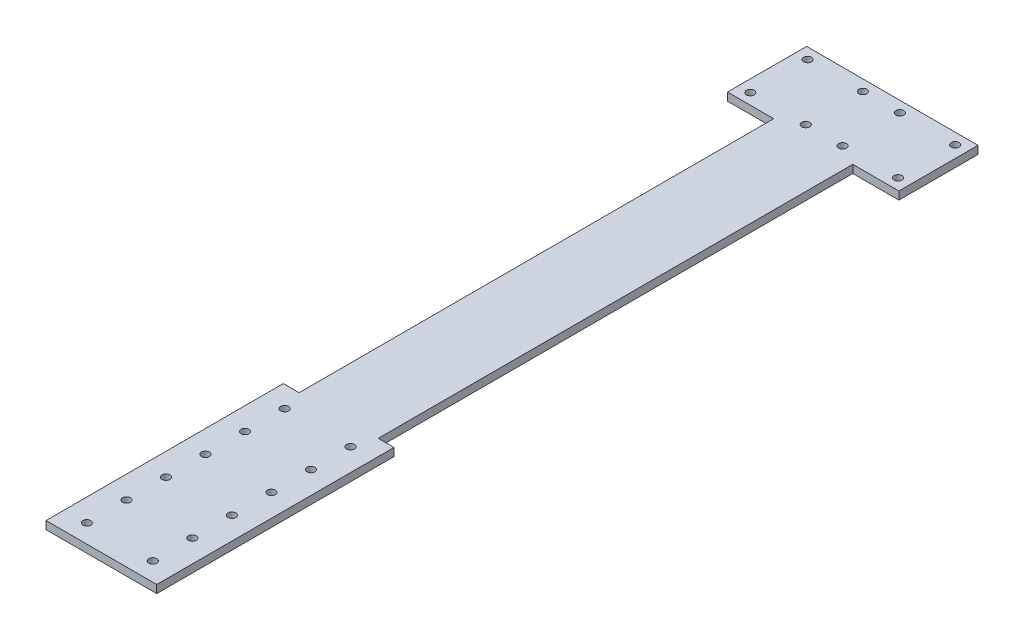
ISO-10303-21;
HEADER;
FILE_DESCRIPTION(('STEP AP214'),'2;1');
FILE_NAME('part.step','',(''),(''),'','','');
FILE_SCHEMA(('AUTOMOTIVE_DESIGN { 1 0 10303 214 1 1 1 1 }'));
ENDSEC;
DATA;
#1=APPLICATION_CONTEXT('core data for automotive mechanical design processes');
#2=APPLICATION_PROTOCOL_DEFINITION('international standard','automotive_design',2000,#1);
#3=PRODUCT_CONTEXT('',#1,'mechanical');
#4=PRODUCT('Part','Part','',(#3));
#5=PRODUCT_RELATED_PRODUCT_CATEGORY('part','',(#4));
#6=PRODUCT_DEFINITION_FORMATION('','',#4);
#7=PRODUCT_DEFINITION_CONTEXT('part definition',#1,'design');
#8=PRODUCT_DEFINITION('design','',#6,#7);
#9=PRODUCT_DEFINITION_SHAPE('','',#8);
#10=(LENGTH_UNIT() NAMED_UNIT(*) SI_UNIT(.MILLI.,.METRE.));
#11=(NAMED_UNIT(*) PLANE_ANGLE_UNIT() SI_UNIT($,.RADIAN.));
#12=(NAMED_UNIT(*) SI_UNIT($,.STERADIAN.) SOLID_ANGLE_UNIT());
#13=UNCERTAINTY_MEASURE_WITH_UNIT(LENGTH_MEASURE(1.E-05),#10,'distance_accuracy_value','');
#14=(GEOMETRIC_REPRESENTATION_CONTEXT(3) GLOBAL_UNCERTAINTY_ASSIGNED_CONTEXT((#13)) GLOBAL_UNIT_ASSIGNED_CONTEXT((#10,
#11,#12)) REPRESENTATION_CONTEXT('',''));
#15=CARTESIAN_POINT('',(0.,0.,0.));
#16=DIRECTION('',(0.,0.,1.));
#17=DIRECTION('',(1.,0.,0.));
#18=AXIS2_PLACEMENT_3D('',#15,#16,#17);
#19=CARTESIAN_POINT('',(0.,3.,0.));
#20=DIRECTION('',(0.,1.,0.));
#21=DIRECTION('',(0.,0.,1.));
#22=AXIS2_PLACEMENT_3D('',#19,#20,#21);
#23=PLANE('',#22);
#24=CARTESIAN_POINT('',(12.5,3.,-22.));
#25=DIRECTION('',(0.,1.,0.));
#26=DIRECTION('',(0.,0.,1.));
#27=AXIS2_PLACEMENT_3D('',#24,#25,#26);
#28=CIRCLE('',#27,1.5);
#29=CARTESIAN_POINT('',(12.5,3.,-20.5));
#30=VERTEX_POINT('',#29);
#31=EDGE_CURVE('E458',#30,#30,#28,.F.);
#32=ORIENTED_EDGE('',*,*,#31,.T.);
#33=EDGE_LOOP('',(#32));
#34=FACE_BOUND('',#33,.T.);
#35=CARTESIAN_POINT('',(-12.5,3.,-6.99999999999999));
#36=DIRECTION('',(0.,1.,0.));
#37=DIRECTION('',(0.,0.,1.));
#38=AXIS2_PLACEMENT_3D('',#35,#36,#37);
#39=CIRCLE('',#38,1.5);
#40=CARTESIAN_POINT('',(-12.5,3.,-5.49999999999999));
#41=VERTEX_POINT('',#40);
#42=EDGE_CURVE('E454',#41,#41,#39,.T.);
#43=ORIENTED_EDGE('',*,*,#42,.F.);
#44=EDGE_LOOP('',(#43));
#45=FACE_BOUND('',#44,.T.);
#46=CARTESIAN_POINT('',(12.5,3.,-52.));
#47=DIRECTION('',(0.,1.,0.));
#48=DIRECTION('',(0.,0.,1.));
#49=AXIS2_PLACEMENT_3D('',#46,#47,#48);
#50=CIRCLE('',#49,1.5);
#51=CARTESIAN_POINT('',(12.5,3.,-50.5));
#52=VERTEX_POINT('',#51);
#53=EDGE_CURVE('E442',#52,#52,#50,.F.);
#54=ORIENTED_EDGE('',*,*,#53,.T.);
#55=EDGE_LOOP('',(#54));
#56=FACE_BOUND('',#55,.T.);
#57=CARTESIAN_POINT('',(-12.5,3.,-37.));
#58=DIRECTION('',(0.,1.,0.));
#59=DIRECTION('',(0.,0.,1.));
#60=AXIS2_PLACEMENT_3D('',#57,#58,#59);
#61=CIRCLE('',#60,1.5);
#62=CARTESIAN_POINT('',(-12.5,3.,-35.5));
#63=VERTEX_POINT('',#62);
#64=EDGE_CURVE('E438',#63,#63,#61,.T.);
#65=ORIENTED_EDGE('',*,*,#64,.F.);
#66=EDGE_LOOP('',(#65));
#67=FACE_BOUND('',#66,.T.);
#68=CARTESIAN_POINT('',(-12.5,3.,-82.));
#69=DIRECTION('',(0.,1.,0.));
#70=DIRECTION('',(0.,0.,1.));
#71=AXIS2_PLACEMENT_3D('',#68,#69,#70);
#72=CIRCLE('',#71,1.5);
#73=CARTESIAN_POINT('',(-12.5,3.,-80.5));
#74=VERTEX_POINT('',#73);
#75=EDGE_CURVE('E481',#74,#74,#72,.T.);
#76=ORIENTED_EDGE('',*,*,#75,.F.);
#77=EDGE_LOOP('',(#76));
#78=FACE_BOUND('',#77,.T.);
#79=DIRECTION('',(0.,0.,1.));
#80=VECTOR('',#79,1.);
#81=CARTESIAN_POINT('',(-32.4999999999998,3.,-300.));
#82=LINE('',#81,#80);
#83=CARTESIAN_POINT('',(-32.4999999999998,3.,-300.));
#84=VERTEX_POINT('',#83);
#85=CARTESIAN_POINT('',(-32.4999999999998,3.,-270.));
#86=VERTEX_POINT('',#85);
#87=EDGE_CURVE('E202',#84,#86,#82,.T.);
#88=ORIENTED_EDGE('',*,*,#87,.T.);
#89=DIRECTION('',(1.,0.,0.));
#90=VECTOR('',#89,1.);
#91=CARTESIAN_POINT('',(-32.4999999999998,3.,-270.));
#92=LINE('',#91,#90);
#93=CARTESIAN_POINT('',(-15.,3.,-270.));
#94=VERTEX_POINT('',#93);
#95=EDGE_CURVE('E114',#86,#94,#92,.T.);
#96=ORIENTED_EDGE('',*,*,#95,.T.);
#97=DIRECTION('',(0.,0.,1.));
#98=VECTOR('',#97,1.);
#99=CARTESIAN_POINT('',(-15.,3.,-270.));
#100=LINE('',#99,#98);
#101=CARTESIAN_POINT('',(-15.,3.,-90.));
#102=VERTEX_POINT('',#101);
#103=EDGE_CURVE('E239',#94,#102,#100,.T.);
#104=ORIENTED_EDGE('',*,*,#103,.T.);
#105=DIRECTION('',(-1.,0.,0.));
#106=VECTOR('',#105,1.);
#107=CARTESIAN_POINT('',(-15.,3.,-90.));
#108=LINE('',#107,#106);
#109=CARTESIAN_POINT('',(-21.,3.,-90.));
#110=VERTEX_POINT('',#109);
#111=EDGE_CURVE('E259',#102,#110,#108,.T.);
#112=ORIENTED_EDGE('',*,*,#111,.T.);
#113=DIRECTION('',(0.,0.,1.));
#114=VECTOR('',#113,1.);
#115=CARTESIAN_POINT('',(-21.,3.,-90.));
#116=LINE('',#115,#114);
#117=CARTESIAN_POINT('',(-21.,3.,0.));
#118=VERTEX_POINT('',#117);
#119=EDGE_CURVE('E255',#110,#118,#116,.T.);
#120=ORIENTED_EDGE('',*,*,#119,.T.);
#121=DIRECTION('',(1.,0.,0.));
#122=VECTOR('',#121,1.);
#123=CARTESIAN_POINT('',(-21.,3.,0.));
#124=LINE('',#123,#122);
#125=CARTESIAN_POINT('',(21.,3.,0.));
#126=VERTEX_POINT('',#125);
#127=EDGE_CURVE('E258',#118,#126,#124,.T.);
#128=ORIENTED_EDGE('',*,*,#127,.T.);
#129=DIRECTION('',(0.,0.,-1.));
#130=VECTOR('',#129,1.);
#131=CARTESIAN_POINT('',(21.,3.,-90.));
#132=LINE('',#131,#130);
#133=CARTESIAN_POINT('',(21.,3.,-90.));
#134=VERTEX_POINT('',#133);
#135=EDGE_CURVE('E263',#126,#134,#132,.T.);
#136=ORIENTED_EDGE('',*,*,#135,.T.);
#137=DIRECTION('',(-1.,0.,0.));
#138=VECTOR('',#137,1.);
#139=CARTESIAN_POINT('',(15.,3.,-90.));
#140=LINE('',#139,#138);
#141=CARTESIAN_POINT('',(15.,3.,-90.));
#142=VERTEX_POINT('',#141);
#143=EDGE_CURVE('E270',#134,#142,#140,.T.);
#144=ORIENTED_EDGE('',*,*,#143,.T.);
#145=DIRECTION('',(0.,0.,-1.));
#146=VECTOR('',#145,1.);
#147=CARTESIAN_POINT('',(15.,3.,-270.));
#148=LINE('',#147,#146);
#149=CARTESIAN_POINT('',(15.,3.,-270.));
#150=VERTEX_POINT('',#149);
#151=EDGE_CURVE('E145',#142,#150,#148,.T.);
#152=ORIENTED_EDGE('',*,*,#151,.T.);
#153=DIRECTION('',(1.,0.,0.));
#154=VECTOR('',#153,1.);
#155=CARTESIAN_POINT('',(32.4999999999998,3.,-270.));
#156=LINE('',#155,#154);
#157=CARTESIAN_POINT('',(32.4999999999998,3.,-270.));
#158=VERTEX_POINT('',#157);
#159=EDGE_CURVE('E139',#150,#158,#156,.T.);
#160=ORIENTED_EDGE('',*,*,#159,.T.);
#161=DIRECTION('',(0.,0.,-1.));
#162=VECTOR('',#161,1.);
#163=CARTESIAN_POINT('',(32.5000000000002,3.,-300.));
#164=LINE('',#163,#162);
#165=CARTESIAN_POINT('',(32.5000000000002,3.,-300.));
#166=VERTEX_POINT('',#165);
#167=EDGE_CURVE('E143',#158,#166,#164,.T.);
#168=ORIENTED_EDGE('',*,*,#167,.T.);
#169=DIRECTION('',(-1.,0.,0.));
#170=VECTOR('',#169,1.);
#171=CARTESIAN_POINT('',(32.5000000000002,3.,-300.));
#172=LINE('',#171,#170);
#173=EDGE_CURVE('E59',#166,#84,#172,.T.);
#174=ORIENTED_EDGE('',*,*,#173,.T.);
#175=EDGE_LOOP('',(#88,#96,#104,#112,#120,#128,#136,#144,#152,#160,#168,#174));
#176=FACE_BOUND('',#175,.T.);
#177=CARTESIAN_POINT('',(-28.,3.,-295.85));
#178=DIRECTION('',(0.,1.,0.));
#179=DIRECTION('',(0.,0.,1.));
#180=AXIS2_PLACEMENT_3D('',#177,#178,#179);
#181=CIRCLE('',#180,1.5);
#182=CARTESIAN_POINT('',(-28.,3.,-294.35));
#183=VERTEX_POINT('',#182);
#184=EDGE_CURVE('E533',#183,#183,#181,.T.);
#185=ORIENTED_EDGE('',*,*,#184,.F.);
#186=EDGE_LOOP('',(#185));
#187=FACE_BOUND('',#186,.T.);
#188=CARTESIAN_POINT('',(-7.00000000000004,3.,-274.15));
#189=DIRECTION('',(0.,1.,0.));
#190=DIRECTION('',(0.,0.,1.));
#191=AXIS2_PLACEMENT_3D('',#188,#189,#190);
#192=CIRCLE('',#191,1.5);
#193=CARTESIAN_POINT('',(-7.00000000000004,3.,-272.65));
#194=VERTEX_POINT('',#193);
#195=EDGE_CURVE('E537',#194,#194,#192,.T.);
#196=ORIENTED_EDGE('',*,*,#195,.F.);
#197=EDGE_LOOP('',(#196));
#198=FACE_BOUND('',#197,.T.);
#199=CARTESIAN_POINT('',(-28.,3.,-274.15));
#200=DIRECTION('',(0.,1.,0.));
#201=DIRECTION('',(0.,0.,1.));
#202=AXIS2_PLACEMENT_3D('',#199,#200,#201);
#203=CIRCLE('',#202,1.5);
#204=CARTESIAN_POINT('',(-28.,3.,-272.65));
#205=VERTEX_POINT('',#204);
#206=EDGE_CURVE('E541',#205,#205,#203,.T.);
#207=ORIENTED_EDGE('',*,*,#206,.F.);
#208=EDGE_LOOP('',(#207));
#209=FACE_BOUND('',#208,.T.);
#210=CARTESIAN_POINT('',(-7.00000000000004,3.,-295.85));
#211=DIRECTION('',(0.,1.,0.));
#212=DIRECTION('',(0.,0.,1.));
#213=AXIS2_PLACEMENT_3D('',#210,#211,#212);
#214=CIRCLE('',#213,1.5);
#215=CARTESIAN_POINT('',(-7.00000000000004,3.,-294.35));
#216=VERTEX_POINT('',#215);
#217=EDGE_CURVE('E172',#216,#216,#214,.T.);
#218=ORIENTED_EDGE('',*,*,#217,.F.);
#219=EDGE_LOOP('',(#218));
#220=FACE_BOUND('',#219,.T.);
#221=CARTESIAN_POINT('',(28.,3.,-295.85));
#222=DIRECTION('',(0.,1.,0.));
#223=DIRECTION('',(0.,0.,1.));
#224=AXIS2_PLACEMENT_3D('',#221,#222,#223);
#225=CIRCLE('',#224,1.5);
#226=CARTESIAN_POINT('',(28.,3.,-294.35));
#227=VERTEX_POINT('',#226);
#228=EDGE_CURVE('E501',#227,#227,#225,.F.);
#229=ORIENTED_EDGE('',*,*,#228,.T.);
#230=EDGE_LOOP('',(#229));
#231=FACE_BOUND('',#230,.T.);
#232=CARTESIAN_POINT('',(7.00000000000004,3.,-274.15));
#233=DIRECTION('',(0.,1.,0.));
#234=DIRECTION('',(0.,0.,1.));
#235=AXIS2_PLACEMENT_3D('',#232,#233,#234);
#236=CIRCLE('',#235,1.5);
#237=CARTESIAN_POINT('',(7.00000000000004,3.,-272.65));
#238=VERTEX_POINT('',#237);
#239=EDGE_CURVE('E505',#238,#238,#236,.F.);
#240=ORIENTED_EDGE('',*,*,#239,.T.);
#241=EDGE_LOOP('',(#240));
#242=FACE_BOUND('',#241,.T.);
#243=CARTESIAN_POINT('',(28.,3.,-274.15));
#244=DIRECTION('',(0.,1.,0.));
#245=DIRECTION('',(0.,0.,1.));
#246=AXIS2_PLACEMENT_3D('',#243,#244,#245);
#247=CIRCLE('',#246,1.5);
#248=CARTESIAN_POINT('',(28.,3.,-272.65));
#249=VERTEX_POINT('',#248);
#250=EDGE_CURVE('E509',#249,#249,#247,.F.);
#251=ORIENTED_EDGE('',*,*,#250,.T.);
#252=EDGE_LOOP('',(#251));
#253=FACE_BOUND('',#252,.T.);
#254=CARTESIAN_POINT('',(7.00000000000004,3.,-295.85));
#255=DIRECTION('',(0.,1.,0.));
#256=DIRECTION('',(0.,0.,1.));
#257=AXIS2_PLACEMENT_3D('',#254,#255,#256);
#258=CIRCLE('',#257,1.5);
#259=CARTESIAN_POINT('',(7.00000000000004,3.,-294.35));
#260=VERTEX_POINT('',#259);
#261=EDGE_CURVE('E513',#260,#260,#258,.F.);
#262=ORIENTED_EDGE('',*,*,#261,.T.);
#263=EDGE_LOOP('',(#262));
#264=FACE_BOUND('',#263,.T.);
#265=CARTESIAN_POINT('',(12.5,3.,-82.));
#266=DIRECTION('',(0.,1.,0.));
#267=DIRECTION('',(0.,0.,1.));
#268=AXIS2_PLACEMENT_3D('',#265,#266,#267);
#269=CIRCLE('',#268,1.5);
#270=CARTESIAN_POINT('',(12.5,3.,-80.5));
#271=VERTEX_POINT('',#270);
#272=EDGE_CURVE('E474',#271,#271,#269,.F.);
#273=ORIENTED_EDGE('',*,*,#272,.T.);
#274=EDGE_LOOP('',(#273));
#275=FACE_BOUND('',#274,.T.);
#276=CARTESIAN_POINT('',(-12.5,3.,-67.));
#277=DIRECTION('',(0.,1.,0.));
#278=DIRECTION('',(0.,0.,1.));
#279=AXIS2_PLACEMENT_3D('',#276,#277,#278);
#280=CIRCLE('',#279,1.5);
#281=CARTESIAN_POINT('',(-12.5,3.,-65.5));
#282=VERTEX_POINT('',#281);
#283=EDGE_CURVE('E432',#282,#282,#280,.T.);
#284=ORIENTED_EDGE('',*,*,#283,.F.);
#285=EDGE_LOOP('',(#284));
#286=FACE_BOUND('',#285,.T.);
#287=CARTESIAN_POINT('',(12.5,3.,-6.99999999999999));
#288=DIRECTION('',(0.,1.,0.));
#289=DIRECTION('',(0.,0.,1.));
#290=AXIS2_PLACEMENT_3D('',#287,#288,#289);
#291=CIRCLE('',#290,1.5);
#292=CARTESIAN_POINT('',(12.5,3.,-5.49999999999999));
#293=VERTEX_POINT('',#292);
#294=EDGE_CURVE('E388',#293,#293,#291,.F.);
#295=ORIENTED_EDGE('',*,*,#294,.T.);
#296=EDGE_LOOP('',(#295));
#297=FACE_BOUND('',#296,.T.);
#298=CARTESIAN_POINT('',(-12.5,3.,-52.));
#299=DIRECTION('',(0.,1.,0.));
#300=DIRECTION('',(0.,0.,1.));
#301=AXIS2_PLACEMENT_3D('',#298,#299,#300);
#302=CIRCLE('',#301,1.5);
#303=CARTESIAN_POINT('',(-12.5,3.,-50.5));
#304=VERTEX_POINT('',#303);
#305=EDGE_CURVE('E446',#304,#304,#302,.T.);
#306=ORIENTED_EDGE('',*,*,#305,.F.);
#307=EDGE_LOOP('',(#306));
#308=FACE_BOUND('',#307,.T.);
#309=CARTESIAN_POINT('',(12.5,3.,-67.));
#310=DIRECTION('',(0.,1.,0.));
#311=DIRECTION('',(0.,0.,1.));
#312=AXIS2_PLACEMENT_3D('',#309,#310,#311);
#313=CIRCLE('',#312,1.5);
#314=CARTESIAN_POINT('',(12.5,3.,-65.5));
#315=VERTEX_POINT('',#314);
#316=EDGE_CURVE('E450',#315,#315,#313,.F.);
#317=ORIENTED_EDGE('',*,*,#316,.T.);
#318=EDGE_LOOP('',(#317));
#319=FACE_BOUND('',#318,.T.);
#320=CARTESIAN_POINT('',(-12.5,3.,-22.));
#321=DIRECTION('',(0.,1.,0.));
#322=DIRECTION('',(0.,0.,1.));
#323=AXIS2_PLACEMENT_3D('',#320,#321,#322);
#324=CIRCLE('',#323,1.5);
#325=CARTESIAN_POINT('',(-12.5,3.,-20.5));
#326=VERTEX_POINT('',#325);
#327=EDGE_CURVE('E461',#326,#326,#324,.T.);
#328=ORIENTED_EDGE('',*,*,#327,.F.);
#329=EDGE_LOOP('',(#328));
#330=FACE_BOUND('',#329,.T.);
#331=CARTESIAN_POINT('',(12.5,3.,-37.));
#332=DIRECTION('',(0.,1.,0.));
#333=DIRECTION('',(0.,0.,1.));
#334=AXIS2_PLACEMENT_3D('',#331,#332,#333);
#335=CIRCLE('',#334,1.5);
#336=CARTESIAN_POINT('',(12.5,3.,-35.5));
#337=VERTEX_POINT('',#336);
#338=EDGE_CURVE('E465',#337,#337,#335,.F.);
#339=ORIENTED_EDGE('',*,*,#338,.T.);
#340=EDGE_LOOP('',(#339));
#341=FACE_BOUND('',#340,.T.);
#342=ADVANCED_FACE('F41',(#34,#45,#56,#67,#78,#176,#187,#198,#209,#220,#231,#242,#253,#264,#275,
#286,#297,#308,#319,#330,#341),#23,.T.);
#343=CARTESIAN_POINT('',(0.,0.,0.));
#344=DIRECTION('',(0.,1.,0.));
#345=DIRECTION('',(0.,0.,1.));
#346=AXIS2_PLACEMENT_3D('',#343,#344,#345);
#347=PLANE('',#346);
#348=CARTESIAN_POINT('',(-12.5,0.,-22.));
#349=DIRECTION('',(0.,1.,0.));
#350=DIRECTION('',(0.,0.,1.));
#351=AXIS2_PLACEMENT_3D('',#348,#349,#350);
#352=CIRCLE('',#351,1.5);
#353=CARTESIAN_POINT('',(-12.5,0.,-20.5));
#354=VERTEX_POINT('',#353);
#355=EDGE_CURVE('E403',#354,#354,#352,.T.);
#356=ORIENTED_EDGE('',*,*,#355,.T.);
#357=EDGE_LOOP('',(#356));
#358=FACE_BOUND('',#357,.T.);
#359=CARTESIAN_POINT('',(-12.5,0.,-6.99999999999999));
#360=DIRECTION('',(0.,1.,0.));
#361=DIRECTION('',(0.,0.,1.));
#362=AXIS2_PLACEMENT_3D('',#359,#360,#361);
#363=CIRCLE('',#362,1.5);
#364=CARTESIAN_POINT('',(-12.5,0.,-5.49999999999999));
#365=VERTEX_POINT('',#364);
#366=EDGE_CURVE('E394',#365,#365,#363,.T.);
#367=ORIENTED_EDGE('',*,*,#366,.T.);
#368=EDGE_LOOP('',(#367));
#369=FACE_BOUND('',#368,.T.);
#370=CARTESIAN_POINT('',(-12.5,0.,-52.));
#371=DIRECTION('',(0.,1.,0.));
#372=DIRECTION('',(0.,0.,1.));
#373=AXIS2_PLACEMENT_3D('',#370,#371,#372);
#374=CIRCLE('',#373,1.5);
#375=CARTESIAN_POINT('',(-12.5,0.,-50.5));
#376=VERTEX_POINT('',#375);
#377=EDGE_CURVE('E417',#376,#376,#374,.T.);
#378=ORIENTED_EDGE('',*,*,#377,.T.);
#379=EDGE_LOOP('',(#378));
#380=FACE_BOUND('',#379,.T.);
#381=CARTESIAN_POINT('',(-12.5,0.,-37.));
#382=DIRECTION('',(0.,1.,0.));
#383=DIRECTION('',(0.,0.,1.));
#384=AXIS2_PLACEMENT_3D('',#381,#382,#383);
#385=CIRCLE('',#384,1.5);
#386=CARTESIAN_POINT('',(-12.5,0.,-35.5));
#387=VERTEX_POINT('',#386);
#388=EDGE_CURVE('E409',#387,#387,#385,.T.);
#389=ORIENTED_EDGE('',*,*,#388,.T.);
#390=EDGE_LOOP('',(#389));
#391=FACE_BOUND('',#390,.T.);
#392=CARTESIAN_POINT('',(-12.5,0.,-67.));
#393=DIRECTION('',(0.,1.,0.));
#394=DIRECTION('',(0.,0.,1.));
#395=AXIS2_PLACEMENT_3D('',#392,#393,#394);
#396=CIRCLE('',#395,1.5);
#397=CARTESIAN_POINT('',(-12.5,0.,-65.5));
#398=VERTEX_POINT('',#397);
#399=EDGE_CURVE('E425',#398,#398,#396,.T.);
#400=ORIENTED_EDGE('',*,*,#399,.T.);
#401=EDGE_LOOP('',(#400));
#402=FACE_BOUND('',#401,.T.);
#403=DIRECTION('',(0.,0.,1.));
#404=VECTOR('',#403,1.);
#405=CARTESIAN_POINT('',(-32.4999999999998,0.,-300.));
#406=LINE('',#405,#404);
#407=CARTESIAN_POINT('',(-32.4999999999998,0.,-300.));
#408=VERTEX_POINT('',#407);
#409=CARTESIAN_POINT('',(-32.4999999999998,0.,-270.));
#410=VERTEX_POINT('',#409);
#411=EDGE_CURVE('E167',#408,#410,#406,.T.);
#412=ORIENTED_EDGE('',*,*,#411,.F.);
#413=DIRECTION('',(-1.,0.,0.));
#414=VECTOR('',#413,1.);
#415=CARTESIAN_POINT('',(32.5000000000002,0.,-300.));
#416=LINE('',#415,#414);
#417=CARTESIAN_POINT('',(32.5000000000002,0.,-300.));
#418=VERTEX_POINT('',#417);
#419=EDGE_CURVE('E106',#418,#408,#416,.T.);
#420=ORIENTED_EDGE('',*,*,#419,.F.);
#421=DIRECTION('',(0.,0.,-1.));
#422=VECTOR('',#421,1.);
#423=CARTESIAN_POINT('',(32.5000000000002,0.,-300.));
#424=LINE('',#423,#422);
#425=CARTESIAN_POINT('',(32.4999999999998,0.,-270.));
#426=VERTEX_POINT('',#425);
#427=EDGE_CURVE('E100',#426,#418,#424,.T.);
#428=ORIENTED_EDGE('',*,*,#427,.F.);
#429=DIRECTION('',(1.,0.,0.));
#430=VECTOR('',#429,1.);
#431=CARTESIAN_POINT('',(32.4999999999998,0.,-270.));
#432=LINE('',#431,#430);
#433=CARTESIAN_POINT('',(15.,0.,-270.));
#434=VERTEX_POINT('',#433);
#435=EDGE_CURVE('E154',#434,#426,#432,.T.);
#436=ORIENTED_EDGE('',*,*,#435,.F.);
#437=DIRECTION('',(0.,0.,-1.));
#438=VECTOR('',#437,1.);
#439=CARTESIAN_POINT('',(15.,0.,-270.));
#440=LINE('',#439,#438);
#441=CARTESIAN_POINT('',(15.,0.,-90.));
#442=VERTEX_POINT('',#441);
#443=EDGE_CURVE('E193',#442,#434,#440,.T.);
#444=ORIENTED_EDGE('',*,*,#443,.F.);
#445=DIRECTION('',(-1.,0.,0.));
#446=VECTOR('',#445,1.);
#447=CARTESIAN_POINT('',(15.,0.,-90.));
#448=LINE('',#447,#446);
#449=CARTESIAN_POINT('',(21.,0.,-90.));
#450=VERTEX_POINT('',#449);
#451=EDGE_CURVE('E190',#450,#442,#448,.T.);
#452=ORIENTED_EDGE('',*,*,#451,.F.);
#453=DIRECTION('',(0.,0.,-1.));
#454=VECTOR('',#453,1.);
#455=CARTESIAN_POINT('',(21.,0.,-90.));
#456=LINE('',#455,#454);
#457=CARTESIAN_POINT('',(21.,0.,0.));
#458=VERTEX_POINT('',#457);
#459=EDGE_CURVE('E187',#458,#450,#456,.T.);
#460=ORIENTED_EDGE('',*,*,#459,.F.);
#461=DIRECTION('',(1.,0.,0.));
#462=VECTOR('',#461,1.);
#463=CARTESIAN_POINT('',(-21.,0.,0.));
#464=LINE('',#463,#462);
#465=CARTESIAN_POINT('',(-21.,0.,0.));
#466=VERTEX_POINT('',#465);
#467=EDGE_CURVE('E184',#466,#458,#464,.T.);
#468=ORIENTED_EDGE('',*,*,#467,.F.);
#469=DIRECTION('',(0.,0.,1.));
#470=VECTOR('',#469,1.);
#471=CARTESIAN_POINT('',(-21.,0.,-90.));
#472=LINE('',#471,#470);
#473=CARTESIAN_POINT('',(-21.,0.,-90.));
#474=VERTEX_POINT('',#473);
#475=EDGE_CURVE('E181',#474,#466,#472,.T.);
#476=ORIENTED_EDGE('',*,*,#475,.F.);
#477=DIRECTION('',(-1.,0.,0.));
#478=VECTOR('',#477,1.);
#479=CARTESIAN_POINT('',(-15.,0.,-90.));
#480=LINE('',#479,#478);
#481=CARTESIAN_POINT('',(-15.,0.,-90.));
#482=VERTEX_POINT('',#481);
#483=EDGE_CURVE('E178',#482,#474,#480,.T.);
#484=ORIENTED_EDGE('',*,*,#483,.F.);
#485=DIRECTION('',(0.,0.,1.));
#486=VECTOR('',#485,1.);
#487=CARTESIAN_POINT('',(-15.,0.,-270.));
#488=LINE('',#487,#486);
#489=CARTESIAN_POINT('',(-15.,0.,-270.));
#490=VERTEX_POINT('',#489);
#491=EDGE_CURVE('E175',#490,#482,#488,.T.);
#492=ORIENTED_EDGE('',*,*,#491,.F.);
#493=DIRECTION('',(1.,0.,0.));
#494=VECTOR('',#493,1.);
#495=CARTESIAN_POINT('',(-32.4999999999998,0.,-270.));
#496=LINE('',#495,#494);
#497=EDGE_CURVE('E171',#410,#490,#496,.T.);
#498=ORIENTED_EDGE('',*,*,#497,.F.);
#499=EDGE_LOOP('',(#412,#420,#428,#436,#444,#452,#460,#468,#476,#484,#492,#498));
#500=FACE_BOUND('',#499,.T.);
#501=CARTESIAN_POINT('',(-28.,0.,-295.85));
#502=DIRECTION('',(0.,1.,0.));
#503=DIRECTION('',(0.,0.,1.));
#504=AXIS2_PLACEMENT_3D('',#501,#502,#503);
#505=CIRCLE('',#504,1.5);
#506=CARTESIAN_POINT('',(-28.,0.,-294.35));
#507=VERTEX_POINT('',#506);
#508=EDGE_CURVE('E526',#507,#507,#505,.T.);
#509=ORIENTED_EDGE('',*,*,#508,.T.);
#510=EDGE_LOOP('',(#509));
#511=FACE_BOUND('',#510,.T.);
#512=CARTESIAN_POINT('',(-7.00000000000004,0.,-274.15));
#513=DIRECTION('',(0.,1.,0.));
#514=DIRECTION('',(0.,0.,1.));
#515=AXIS2_PLACEMENT_3D('',#512,#513,#514);
#516=CIRCLE('',#515,1.5);
#517=CARTESIAN_POINT('',(-7.00000000000004,0.,-272.65));
#518=VERTEX_POINT('',#517);
#519=EDGE_CURVE('E517',#518,#518,#516,.T.);
#520=ORIENTED_EDGE('',*,*,#519,.T.);
#521=EDGE_LOOP('',(#520));
#522=FACE_BOUND('',#521,.T.);
#523=CARTESIAN_POINT('',(-28.,0.,-274.15));
#524=DIRECTION('',(0.,1.,0.));
#525=DIRECTION('',(0.,0.,-1.));
#526=AXIS2_PLACEMENT_3D('',#523,#524,#525);
#527=CIRCLE('',#526,1.5);
#528=CARTESIAN_POINT('',(-28.,0.,-275.65));
#529=VERTEX_POINT('',#528);
#530=EDGE_CURVE('E521',#529,#529,#527,.T.);
#531=ORIENTED_EDGE('',*,*,#530,.T.);
#532=EDGE_LOOP('',(#531));
#533=FACE_BOUND('',#532,.T.);
#534=CARTESIAN_POINT('',(-7.00000000000004,0.,-295.85));
#535=DIRECTION('',(0.,1.,0.));
#536=DIRECTION('',(0.,0.,-1.));
#537=AXIS2_PLACEMENT_3D('',#534,#535,#536);
#538=CIRCLE('',#537,1.5);
#539=CARTESIAN_POINT('',(-7.00000000000004,0.,-297.35));
#540=VERTEX_POINT('',#539);
#541=EDGE_CURVE('E522',#540,#540,#538,.T.);
#542=ORIENTED_EDGE('',*,*,#541,.T.);
#543=EDGE_LOOP('',(#542));
#544=FACE_BOUND('',#543,.T.);
#545=CARTESIAN_POINT('',(28.,0.,-295.85));
#546=DIRECTION('',(0.,-1.,0.));
#547=DIRECTION('',(0.,0.,1.));
#548=AXIS2_PLACEMENT_3D('',#545,#546,#547);
#549=CIRCLE('',#548,1.5);
#550=CARTESIAN_POINT('',(28.,0.,-294.35));
#551=VERTEX_POINT('',#550);
#552=EDGE_CURVE('E494',#551,#551,#549,.T.);
#553=ORIENTED_EDGE('',*,*,#552,.F.);
#554=EDGE_LOOP('',(#553));
#555=FACE_BOUND('',#554,.T.);
#556=CARTESIAN_POINT('',(7.00000000000004,0.,-274.15));
#557=DIRECTION('',(0.,-1.,0.));
#558=DIRECTION('',(0.,0.,1.));
#559=AXIS2_PLACEMENT_3D('',#556,#557,#558);
#560=CIRCLE('',#559,1.5);
#561=CARTESIAN_POINT('',(7.00000000000004,0.,-272.65));
#562=VERTEX_POINT('',#561);
#563=EDGE_CURVE('E485',#562,#562,#560,.T.);
#564=ORIENTED_EDGE('',*,*,#563,.F.);
#565=EDGE_LOOP('',(#564));
#566=FACE_BOUND('',#565,.T.);
#567=CARTESIAN_POINT('',(28.,0.,-274.15));
#568=DIRECTION('',(0.,-1.,0.));
#569=DIRECTION('',(0.,0.,-1.));
#570=AXIS2_PLACEMENT_3D('',#567,#568,#569);
#571=CIRCLE('',#570,1.5);
#572=CARTESIAN_POINT('',(28.,0.,-275.65));
#573=VERTEX_POINT('',#572);
#574=EDGE_CURVE('E489',#573,#573,#571,.T.);
#575=ORIENTED_EDGE('',*,*,#574,.F.);
#576=EDGE_LOOP('',(#575));
#577=FACE_BOUND('',#576,.T.);
#578=CARTESIAN_POINT('',(7.00000000000004,0.,-295.85));
#579=DIRECTION('',(0.,-1.,0.));
#580=DIRECTION('',(0.,0.,-1.));
#581=AXIS2_PLACEMENT_3D('',#578,#579,#580);
#582=CIRCLE('',#581,1.5);
#583=CARTESIAN_POINT('',(7.00000000000004,0.,-297.35));
#584=VERTEX_POINT('',#583);
#585=EDGE_CURVE('E490',#584,#584,#582,.T.);
#586=ORIENTED_EDGE('',*,*,#585,.F.);
#587=EDGE_LOOP('',(#586));
#588=FACE_BOUND('',#587,.T.);
#589=CARTESIAN_POINT('',(12.5,0.,-82.));
#590=DIRECTION('',(0.,1.,0.));
#591=DIRECTION('',(0.,0.,1.));
#592=AXIS2_PLACEMENT_3D('',#589,#590,#591);
#593=CIRCLE('',#592,1.5);
#594=CARTESIAN_POINT('',(12.5,0.,-80.5));
#595=VERTEX_POINT('',#594);
#596=EDGE_CURVE('E469',#595,#595,#593,.F.);
#597=ORIENTED_EDGE('',*,*,#596,.F.);
#598=EDGE_LOOP('',(#597));
#599=FACE_BOUND('',#598,.T.);
#600=CARTESIAN_POINT('',(-12.5,0.,-82.));
#601=DIRECTION('',(0.,1.,0.));
#602=DIRECTION('',(0.,0.,1.));
#603=AXIS2_PLACEMENT_3D('',#600,#601,#602);
#604=CIRCLE('',#603,1.5);
#605=CARTESIAN_POINT('',(-12.5,0.,-80.5));
#606=VERTEX_POINT('',#605);
#607=EDGE_CURVE('E470',#606,#606,#604,.T.);
#608=ORIENTED_EDGE('',*,*,#607,.T.);
#609=EDGE_LOOP('',(#608));
#610=FACE_BOUND('',#609,.T.);
#611=CARTESIAN_POINT('',(12.5,0.,-6.99999999999999));
#612=DIRECTION('',(0.,1.,0.));
#613=DIRECTION('',(0.,0.,1.));
#614=AXIS2_PLACEMENT_3D('',#611,#612,#613);
#615=CIRCLE('',#614,1.5);
#616=CARTESIAN_POINT('',(12.5,0.,-5.49999999999999));
#617=VERTEX_POINT('',#616);
#618=EDGE_CURVE('E391',#617,#617,#615,.F.);
#619=ORIENTED_EDGE('',*,*,#618,.F.);
#620=EDGE_LOOP('',(#619));
#621=FACE_BOUND('',#620,.T.);
#622=CARTESIAN_POINT('',(12.5,0.,-52.));
#623=DIRECTION('',(0.,1.,0.));
#624=DIRECTION('',(0.,0.,1.));
#625=AXIS2_PLACEMENT_3D('',#622,#623,#624);
#626=CIRCLE('',#625,1.5);
#627=CARTESIAN_POINT('',(12.5,0.,-50.5));
#628=VERTEX_POINT('',#627);
#629=EDGE_CURVE('E413',#628,#628,#626,.F.);
#630=ORIENTED_EDGE('',*,*,#629,.F.);
#631=EDGE_LOOP('',(#630));
#632=FACE_BOUND('',#631,.T.);
#633=CARTESIAN_POINT('',(12.5,0.,-67.));
#634=DIRECTION('',(0.,1.,0.));
#635=DIRECTION('',(0.,0.,1.));
#636=AXIS2_PLACEMENT_3D('',#633,#634,#635);
#637=CIRCLE('',#636,1.5);
#638=CARTESIAN_POINT('',(12.5,0.,-65.5));
#639=VERTEX_POINT('',#638);
#640=EDGE_CURVE('E421',#639,#639,#637,.F.);
#641=ORIENTED_EDGE('',*,*,#640,.F.);
#642=EDGE_LOOP('',(#641));
#643=FACE_BOUND('',#642,.T.);
#644=CARTESIAN_POINT('',(12.5,0.,-22.));
#645=DIRECTION('',(0.,1.,0.));
#646=DIRECTION('',(0.,0.,1.));
#647=AXIS2_PLACEMENT_3D('',#644,#645,#646);
#648=CIRCLE('',#647,1.5);
#649=CARTESIAN_POINT('',(12.5,0.,-20.5));
#650=VERTEX_POINT('',#649);
#651=EDGE_CURVE('E398',#650,#650,#648,.F.);
#652=ORIENTED_EDGE('',*,*,#651,.F.);
#653=EDGE_LOOP('',(#652));
#654=FACE_BOUND('',#653,.T.);
#655=CARTESIAN_POINT('',(12.5,0.,-37.));
#656=DIRECTION('',(0.,1.,0.));
#657=DIRECTION('',(0.,0.,1.));
#658=AXIS2_PLACEMENT_3D('',#655,#656,#657);
#659=CIRCLE('',#658,1.5);
#660=CARTESIAN_POINT('',(12.5,0.,-35.5));
#661=VERTEX_POINT('',#660);
#662=EDGE_CURVE('E405',#661,#661,#659,.F.);
#663=ORIENTED_EDGE('',*,*,#662,.F.);
#664=EDGE_LOOP('',(#663));
#665=FACE_BOUND('',#664,.T.);
#666=ADVANCED_FACE('F243',(#358,#369,#380,#391,#402,#500,#511,#522,#533,#544,#555,#566,#577,
#588,#599,#610,#621,#632,#643,#654,#665),#347,.F.);
#667=CARTESIAN_POINT('',(-32.4999999999998,3.,-300.));
#668=DIRECTION('',(1.,0.,0.));
#669=DIRECTION('',(0.,0.,-1.));
#670=AXIS2_PLACEMENT_3D('',#667,#668,#669);
#671=PLANE('',#670);
#672=ORIENTED_EDGE('',*,*,#411,.T.);
#673=DIRECTION('',(0.,-1.,0.));
#674=VECTOR('',#673,1.);
#675=CARTESIAN_POINT('',(-32.4999999999998,3.,-270.));
#676=LINE('',#675,#674);
#677=EDGE_CURVE('E11',#86,#410,#676,.T.);
#678=ORIENTED_EDGE('',*,*,#677,.F.);
#679=ORIENTED_EDGE('',*,*,#87,.F.);
#680=DIRECTION('',(0.,-1.,0.));
#681=VECTOR('',#680,1.);
#682=CARTESIAN_POINT('',(-32.4999999999998,3.,-300.));
#683=LINE('',#682,#681);
#684=EDGE_CURVE('E163',#84,#408,#683,.T.);
#685=ORIENTED_EDGE('',*,*,#684,.T.);
#686=EDGE_LOOP('',(#672,#678,#679,#685));
#687=FACE_BOUND('',#686,.T.);
#688=ADVANCED_FACE('F43',(#687),#671,.F.);
#689=CARTESIAN_POINT('',(-32.4999999999998,3.,-270.));
#690=DIRECTION('',(0.,0.,-1.));
#691=DIRECTION('',(-1.,0.,0.));
#692=AXIS2_PLACEMENT_3D('',#689,#690,#691);
#693=PLANE('',#692);
#694=ORIENTED_EDGE('',*,*,#497,.T.);
#695=DIRECTION('',(0.,-1.,0.));
#696=VECTOR('',#695,1.);
#697=CARTESIAN_POINT('',(-15.,3.,-270.));
#698=LINE('',#697,#696);
#699=EDGE_CURVE('E51',#94,#490,#698,.T.);
#700=ORIENTED_EDGE('',*,*,#699,.F.);
#701=ORIENTED_EDGE('',*,*,#95,.F.);
#702=ORIENTED_EDGE('',*,*,#677,.T.);
#703=EDGE_LOOP('',(#694,#700,#701,#702));
#704=FACE_BOUND('',#703,.T.);
#705=ADVANCED_FACE('F829',(#704),#693,.F.);
#706=CARTESIAN_POINT('',(-15.,3.,-270.));
#707=DIRECTION('',(1.,0.,0.));
#708=DIRECTION('',(0.,0.,-1.));
#709=AXIS2_PLACEMENT_3D('',#706,#707,#708);
#710=PLANE('',#709);
#711=ORIENTED_EDGE('',*,*,#491,.T.);
#712=DIRECTION('',(0.,-1.,0.));
#713=VECTOR('',#712,1.);
#714=CARTESIAN_POINT('',(-15.,3.,-90.));
#715=LINE('',#714,#713);
#716=EDGE_CURVE('E229',#102,#482,#715,.T.);
#717=ORIENTED_EDGE('',*,*,#716,.F.);
#718=ORIENTED_EDGE('',*,*,#103,.F.);
#719=ORIENTED_EDGE('',*,*,#699,.T.);
#720=EDGE_LOOP('',(#711,#717,#718,#719));
#721=FACE_BOUND('',#720,.T.);
#722=ADVANCED_FACE('F237',(#721),#710,.F.);
#723=CARTESIAN_POINT('',(-15.,3.,-90.));
#724=DIRECTION('',(0.,0.,1.));
#725=DIRECTION('',(1.,0.,0.));
#726=AXIS2_PLACEMENT_3D('',#723,#724,#725);
#727=PLANE('',#726);
#728=ORIENTED_EDGE('',*,*,#483,.T.);
#729=DIRECTION('',(0.,-1.,0.));
#730=VECTOR('',#729,1.);
#731=CARTESIAN_POINT('',(-21.,3.,-90.));
#732=LINE('',#731,#730);
#733=EDGE_CURVE('E225',#110,#474,#732,.T.);
#734=ORIENTED_EDGE('',*,*,#733,.F.);
#735=ORIENTED_EDGE('',*,*,#111,.F.);
#736=ORIENTED_EDGE('',*,*,#716,.T.);
#737=EDGE_LOOP('',(#728,#734,#735,#736));
#738=FACE_BOUND('',#737,.T.);
#739=ADVANCED_FACE('F249',(#738),#727,.F.);
#740=CARTESIAN_POINT('',(-21.,3.,-90.));
#741=DIRECTION('',(1.,0.,0.));
#742=DIRECTION('',(0.,0.,-1.));
#743=AXIS2_PLACEMENT_3D('',#740,#741,#742);
#744=PLANE('',#743);
#745=ORIENTED_EDGE('',*,*,#475,.T.);
#746=DIRECTION('',(0.,-1.,0.));
#747=VECTOR('',#746,1.);
#748=CARTESIAN_POINT('',(-21.,3.,0.));
#749=LINE('',#748,#747);
#750=EDGE_CURVE('E221',#118,#466,#749,.T.);
#751=ORIENTED_EDGE('',*,*,#750,.F.);
#752=ORIENTED_EDGE('',*,*,#119,.F.);
#753=ORIENTED_EDGE('',*,*,#733,.T.);
#754=EDGE_LOOP('',(#745,#751,#752,#753));
#755=FACE_BOUND('',#754,.T.);
#756=ADVANCED_FACE('F253',(#755),#744,.F.);
#757=CARTESIAN_POINT('',(-21.,3.,0.));
#758=DIRECTION('',(0.,0.,-1.));
#759=DIRECTION('',(-1.,0.,0.));
#760=AXIS2_PLACEMENT_3D('',#757,#758,#759);
#761=PLANE('',#760);
#762=ORIENTED_EDGE('',*,*,#467,.T.);
#763=DIRECTION('',(0.,-1.,0.));
#764=VECTOR('',#763,1.);
#765=CARTESIAN_POINT('',(21.,3.,0.));
#766=LINE('',#765,#764);
#767=EDGE_CURVE('E217',#126,#458,#766,.T.);
#768=ORIENTED_EDGE('',*,*,#767,.F.);
#769=ORIENTED_EDGE('',*,*,#127,.F.);
#770=ORIENTED_EDGE('',*,*,#750,.T.);
#771=EDGE_LOOP('',(#762,#768,#769,#770));
#772=FACE_BOUND('',#771,.T.);
#773=ADVANCED_FACE('F798',(#772),#761,.F.);
#774=CARTESIAN_POINT('',(21.,3.,-90.));
#775=DIRECTION('',(-1.,0.,0.));
#776=DIRECTION('',(0.,0.,1.));
#777=AXIS2_PLACEMENT_3D('',#774,#775,#776);
#778=PLANE('',#777);
#779=ORIENTED_EDGE('',*,*,#459,.T.);
#780=DIRECTION('',(0.,-1.,0.));
#781=VECTOR('',#780,1.);
#782=CARTESIAN_POINT('',(21.,3.,-90.));
#783=LINE('',#782,#781);
#784=EDGE_CURVE('E213',#134,#450,#783,.T.);
#785=ORIENTED_EDGE('',*,*,#784,.F.);
#786=ORIENTED_EDGE('',*,*,#135,.F.);
#787=ORIENTED_EDGE('',*,*,#767,.T.);
#788=EDGE_LOOP('',(#779,#785,#786,#787));
#789=FACE_BOUND('',#788,.T.);
#790=ADVANCED_FACE('F790',(#789),#778,.F.);
#791=CARTESIAN_POINT('',(15.,3.,-90.));
#792=DIRECTION('',(0.,0.,1.));
#793=DIRECTION('',(1.,0.,0.));
#794=AXIS2_PLACEMENT_3D('',#791,#792,#793);
#795=PLANE('',#794);
#796=ORIENTED_EDGE('',*,*,#451,.T.);
#797=DIRECTION('',(0.,-1.,0.));
#798=VECTOR('',#797,1.);
#799=CARTESIAN_POINT('',(15.,3.,-90.));
#800=LINE('',#799,#798);
#801=EDGE_CURVE('E209',#142,#442,#800,.T.);
#802=ORIENTED_EDGE('',*,*,#801,.F.);
#803=ORIENTED_EDGE('',*,*,#143,.F.);
#804=ORIENTED_EDGE('',*,*,#784,.T.);
#805=EDGE_LOOP('',(#796,#802,#803,#804));
#806=FACE_BOUND('',#805,.T.);
#807=ADVANCED_FACE('F278',(#806),#795,.F.);
#808=CARTESIAN_POINT('',(15.,3.,-270.));
#809=DIRECTION('',(-1.,0.,0.));
#810=DIRECTION('',(0.,0.,1.));
#811=AXIS2_PLACEMENT_3D('',#808,#809,#810);
#812=PLANE('',#811);
#813=ORIENTED_EDGE('',*,*,#443,.T.);
#814=DIRECTION('',(0.,-1.,0.));
#815=VECTOR('',#814,1.);
#816=CARTESIAN_POINT('',(15.,3.,-270.));
#817=LINE('',#816,#815);
#818=EDGE_CURVE('E156',#150,#434,#817,.T.);
#819=ORIENTED_EDGE('',*,*,#818,.F.);
#820=ORIENTED_EDGE('',*,*,#151,.F.);
#821=ORIENTED_EDGE('',*,*,#801,.T.);
#822=EDGE_LOOP('',(#813,#819,#820,#821));
#823=FACE_BOUND('',#822,.T.);
#824=ADVANCED_FACE('F282',(#823),#812,.F.);
#825=CARTESIAN_POINT('',(32.4999999999998,3.,-270.));
#826=DIRECTION('',(0.,0.,-1.));
#827=DIRECTION('',(-1.,0.,0.));
#828=AXIS2_PLACEMENT_3D('',#825,#826,#827);
#829=PLANE('',#828);
#830=ORIENTED_EDGE('',*,*,#435,.T.);
#831=DIRECTION('',(0.,-1.,0.));
#832=VECTOR('',#831,1.);
#833=CARTESIAN_POINT('',(32.4999999999998,3.,-270.));
#834=LINE('',#833,#832);
#835=EDGE_CURVE('E151',#158,#426,#834,.T.);
#836=ORIENTED_EDGE('',*,*,#835,.F.);
#837=ORIENTED_EDGE('',*,*,#159,.F.);
#838=ORIENTED_EDGE('',*,*,#818,.T.);
#839=EDGE_LOOP('',(#830,#836,#837,#838));
#840=FACE_BOUND('',#839,.T.);
#841=ADVANCED_FACE('F152',(#840),#829,.F.);
#842=CARTESIAN_POINT('',(32.5000000000002,3.,-300.));
#843=DIRECTION('',(-1.,0.,0.));
#844=DIRECTION('',(0.,0.,1.));
#845=AXIS2_PLACEMENT_3D('',#842,#843,#844);
#846=PLANE('',#845);
#847=ORIENTED_EDGE('',*,*,#427,.T.);
#848=DIRECTION('',(0.,-1.,0.));
#849=VECTOR('',#848,1.);
#850=CARTESIAN_POINT('',(32.5000000000002,3.,-300.));
#851=LINE('',#850,#849);
#852=EDGE_CURVE('E157',#166,#418,#851,.T.);
#853=ORIENTED_EDGE('',*,*,#852,.F.);
#854=ORIENTED_EDGE('',*,*,#167,.F.);
#855=ORIENTED_EDGE('',*,*,#835,.T.);
#856=EDGE_LOOP('',(#847,#853,#854,#855));
#857=FACE_BOUND('',#856,.T.);
#858=ADVANCED_FACE('F159',(#857),#846,.F.);
#859=CARTESIAN_POINT('',(32.5000000000002,3.,-300.));
#860=DIRECTION('',(0.,0.,1.));
#861=DIRECTION('',(1.,0.,0.));
#862=AXIS2_PLACEMENT_3D('',#859,#860,#861);
#863=PLANE('',#862);
#864=ORIENTED_EDGE('',*,*,#419,.T.);
#865=ORIENTED_EDGE('',*,*,#684,.F.);
#866=ORIENTED_EDGE('',*,*,#173,.F.);
#867=ORIENTED_EDGE('',*,*,#852,.T.);
#868=EDGE_LOOP('',(#864,#865,#866,#867));
#869=FACE_BOUND('',#868,.T.);
#870=ADVANCED_FACE('F286',(#869),#863,.F.);
#871=CARTESIAN_POINT('',(-28.,0.,-295.85));
#872=DIRECTION('',(0.,1.,0.));
#873=DIRECTION('',(0.,0.,1.));
#874=AXIS2_PLACEMENT_3D('',#871,#872,#873);
#875=CYLINDRICAL_SURFACE('',#874,1.5);
#876=ORIENTED_EDGE('',*,*,#184,.T.);
#877=EDGE_LOOP('',(#876));
#878=FACE_BOUND('',#877,.T.);
#879=ORIENTED_EDGE('',*,*,#508,.F.);
#880=EDGE_LOOP('',(#879));
#881=FACE_BOUND('',#880,.T.);
#882=ADVANCED_FACE('F288',(#878,#881),#875,.F.);
#883=CARTESIAN_POINT('',(-7.00000000000004,0.,-274.15));
#884=DIRECTION('',(0.,1.,0.));
#885=DIRECTION('',(0.,0.,1.));
#886=AXIS2_PLACEMENT_3D('',#883,#884,#885);
#887=CYLINDRICAL_SURFACE('',#886,1.5);
#888=ORIENTED_EDGE('',*,*,#195,.T.);
#889=EDGE_LOOP('',(#888));
#890=FACE_BOUND('',#889,.T.);
#891=ORIENTED_EDGE('',*,*,#519,.F.);
#892=EDGE_LOOP('',(#891));
#893=FACE_BOUND('',#892,.T.);
#894=ADVANCED_FACE('F294',(#890,#893),#887,.F.);
#895=CARTESIAN_POINT('',(-28.,0.,-274.15));
#896=DIRECTION('',(0.,1.,0.));
#897=DIRECTION('',(0.,0.,1.));
#898=AXIS2_PLACEMENT_3D('',#895,#896,#897);
#899=CYLINDRICAL_SURFACE('',#898,1.5);
#900=ORIENTED_EDGE('',*,*,#206,.T.);
#901=EDGE_LOOP('',(#900));
#902=FACE_BOUND('',#901,.T.);
#903=ORIENTED_EDGE('',*,*,#530,.F.);
#904=EDGE_LOOP('',(#903));
#905=FACE_BOUND('',#904,.T.);
#906=ADVANCED_FACE('F309',(#902,#905),#899,.F.);
#907=CARTESIAN_POINT('',(-7.00000000000004,0.,-295.85));
#908=DIRECTION('',(0.,1.,0.));
#909=DIRECTION('',(0.,0.,1.));
#910=AXIS2_PLACEMENT_3D('',#907,#908,#909);
#911=CYLINDRICAL_SURFACE('',#910,1.5);
#912=ORIENTED_EDGE('',*,*,#217,.T.);
#913=EDGE_LOOP('',(#912));
#914=FACE_BOUND('',#913,.T.);
#915=ORIENTED_EDGE('',*,*,#541,.F.);
#916=EDGE_LOOP('',(#915));
#917=FACE_BOUND('',#916,.T.);
#918=ADVANCED_FACE('F312',(#914,#917),#911,.F.);
#919=CARTESIAN_POINT('',(28.,0.,-295.85));
#920=DIRECTION('',(0.,1.,0.));
#921=DIRECTION('',(0.,0.,1.));
#922=AXIS2_PLACEMENT_3D('',#919,#920,#921);
#923=CYLINDRICAL_SURFACE('',#922,1.5);
#924=ORIENTED_EDGE('',*,*,#228,.F.);
#925=EDGE_LOOP('',(#924));
#926=FACE_BOUND('',#925,.T.);
#927=ORIENTED_EDGE('',*,*,#552,.T.);
#928=EDGE_LOOP('',(#927));
#929=FACE_BOUND('',#928,.T.);
#930=ADVANCED_FACE('F316',(#926,#929),#923,.F.);
#931=CARTESIAN_POINT('',(7.00000000000004,0.,-274.15));
#932=DIRECTION('',(0.,1.,0.));
#933=DIRECTION('',(0.,0.,1.));
#934=AXIS2_PLACEMENT_3D('',#931,#932,#933);
#935=CYLINDRICAL_SURFACE('',#934,1.5);
#936=ORIENTED_EDGE('',*,*,#239,.F.);
#937=EDGE_LOOP('',(#936));
#938=FACE_BOUND('',#937,.T.);
#939=ORIENTED_EDGE('',*,*,#563,.T.);
#940=EDGE_LOOP('',(#939));
#941=FACE_BOUND('',#940,.T.);
#942=ADVANCED_FACE('F323',(#938,#941),#935,.F.);
#943=CARTESIAN_POINT('',(28.,0.,-274.15));
#944=DIRECTION('',(0.,1.,0.));
#945=DIRECTION('',(0.,0.,1.));
#946=AXIS2_PLACEMENT_3D('',#943,#944,#945);
#947=CYLINDRICAL_SURFACE('',#946,1.5);
#948=ORIENTED_EDGE('',*,*,#250,.F.);
#949=EDGE_LOOP('',(#948));
#950=FACE_BOUND('',#949,.T.);
#951=ORIENTED_EDGE('',*,*,#574,.T.);
#952=EDGE_LOOP('',(#951));
#953=FACE_BOUND('',#952,.T.);
#954=ADVANCED_FACE('F325',(#950,#953),#947,.F.);
#955=CARTESIAN_POINT('',(7.00000000000004,0.,-295.85));
#956=DIRECTION('',(0.,1.,0.));
#957=DIRECTION('',(0.,0.,1.));
#958=AXIS2_PLACEMENT_3D('',#955,#956,#957);
#959=CYLINDRICAL_SURFACE('',#958,1.5);
#960=ORIENTED_EDGE('',*,*,#261,.F.);
#961=EDGE_LOOP('',(#960));
#962=FACE_BOUND('',#961,.T.);
#963=ORIENTED_EDGE('',*,*,#585,.T.);
#964=EDGE_LOOP('',(#963));
#965=FACE_BOUND('',#964,.T.);
#966=ADVANCED_FACE('F328',(#962,#965),#959,.F.);
#967=CARTESIAN_POINT('',(12.5,0.,-82.));
#968=DIRECTION('',(0.,1.,0.));
#969=DIRECTION('',(0.,0.,1.));
#970=AXIS2_PLACEMENT_3D('',#967,#968,#969);
#971=CYLINDRICAL_SURFACE('',#970,1.5);
#972=ORIENTED_EDGE('',*,*,#272,.F.);
#973=EDGE_LOOP('',(#972));
#974=FACE_BOUND('',#973,.T.);
#975=ORIENTED_EDGE('',*,*,#596,.T.);
#976=EDGE_LOOP('',(#975));
#977=FACE_BOUND('',#976,.T.);
#978=ADVANCED_FACE('F332',(#974,#977),#971,.F.);
#979=CARTESIAN_POINT('',(-12.5,0.,-82.));
#980=DIRECTION('',(0.,1.,0.));
#981=DIRECTION('',(0.,0.,1.));
#982=AXIS2_PLACEMENT_3D('',#979,#980,#981);
#983=CYLINDRICAL_SURFACE('',#982,1.5);
#984=ORIENTED_EDGE('',*,*,#75,.T.);
#985=EDGE_LOOP('',(#984));
#986=FACE_BOUND('',#985,.T.);
#987=ORIENTED_EDGE('',*,*,#607,.F.);
#988=EDGE_LOOP('',(#987));
#989=FACE_BOUND('',#988,.T.);
#990=ADVANCED_FACE('F339',(#986,#989),#983,.F.);
#991=CARTESIAN_POINT('',(-12.5,0.,-67.));
#992=DIRECTION('',(0.,1.,0.));
#993=DIRECTION('',(0.,0.,1.));
#994=AXIS2_PLACEMENT_3D('',#991,#992,#993);
#995=CYLINDRICAL_SURFACE('',#994,1.5);
#996=ORIENTED_EDGE('',*,*,#283,.T.);
#997=EDGE_LOOP('',(#996));
#998=FACE_BOUND('',#997,.T.);
#999=ORIENTED_EDGE('',*,*,#399,.F.);
#1000=EDGE_LOOP('',(#999));
#1001=FACE_BOUND('',#1000,.T.);
#1002=ADVANCED_FACE('F343',(#998,#1001),#995,.F.);
#1003=CARTESIAN_POINT('',(12.5,0.,-6.99999999999999));
#1004=DIRECTION('',(0.,1.,0.));
#1005=DIRECTION('',(0.,0.,1.));
#1006=AXIS2_PLACEMENT_3D('',#1003,#1004,#1005);
#1007=CYLINDRICAL_SURFACE('',#1006,1.5);
#1008=ORIENTED_EDGE('',*,*,#294,.F.);
#1009=EDGE_LOOP('',(#1008));
#1010=FACE_BOUND('',#1009,.T.);
#1011=ORIENTED_EDGE('',*,*,#618,.T.);
#1012=EDGE_LOOP('',(#1011));
#1013=FACE_BOUND('',#1012,.T.);
#1014=ADVANCED_FACE('F347',(#1010,#1013),#1007,.F.);
#1015=CARTESIAN_POINT('',(-12.5,0.,-37.));
#1016=DIRECTION('',(0.,1.,0.));
#1017=DIRECTION('',(0.,0.,1.));
#1018=AXIS2_PLACEMENT_3D('',#1015,#1016,#1017);
#1019=CYLINDRICAL_SURFACE('',#1018,1.5);
#1020=ORIENTED_EDGE('',*,*,#64,.T.);
#1021=EDGE_LOOP('',(#1020));
#1022=FACE_BOUND('',#1021,.T.);
#1023=ORIENTED_EDGE('',*,*,#388,.F.);
#1024=EDGE_LOOP('',(#1023));
#1025=FACE_BOUND('',#1024,.T.);
#1026=ADVANCED_FACE('F359',(#1022,#1025),#1019,.F.);
#1027=CARTESIAN_POINT('',(12.5,0.,-52.));
#1028=DIRECTION('',(0.,1.,0.));
#1029=DIRECTION('',(0.,0.,1.));
#1030=AXIS2_PLACEMENT_3D('',#1027,#1028,#1029);
#1031=CYLINDRICAL_SURFACE('',#1030,1.5);
#1032=ORIENTED_EDGE('',*,*,#53,.F.);
#1033=EDGE_LOOP('',(#1032));
#1034=FACE_BOUND('',#1033,.T.);
#1035=ORIENTED_EDGE('',*,*,#629,.T.);
#1036=EDGE_LOOP('',(#1035));
#1037=FACE_BOUND('',#1036,.T.);
#1038=ADVANCED_FACE('F353',(#1034,#1037),#1031,.F.);
#1039=CARTESIAN_POINT('',(-12.5,0.,-52.));
#1040=DIRECTION('',(0.,1.,0.));
#1041=DIRECTION('',(0.,0.,1.));
#1042=AXIS2_PLACEMENT_3D('',#1039,#1040,#1041);
#1043=CYLINDRICAL_SURFACE('',#1042,1.5);
#1044=ORIENTED_EDGE('',*,*,#305,.T.);
#1045=EDGE_LOOP('',(#1044));
#1046=FACE_BOUND('',#1045,.T.);
#1047=ORIENTED_EDGE('',*,*,#377,.F.);
#1048=EDGE_LOOP('',(#1047));
#1049=FACE_BOUND('',#1048,.T.);
#1050=ADVANCED_FACE('F349',(#1046,#1049),#1043,.F.);
#1051=CARTESIAN_POINT('',(12.5,0.,-67.));
#1052=DIRECTION('',(0.,1.,0.));
#1053=DIRECTION('',(0.,0.,1.));
#1054=AXIS2_PLACEMENT_3D('',#1051,#1052,#1053);
#1055=CYLINDRICAL_SURFACE('',#1054,1.5);
#1056=ORIENTED_EDGE('',*,*,#316,.F.);
#1057=EDGE_LOOP('',(#1056));
#1058=FACE_BOUND('',#1057,.T.);
#1059=ORIENTED_EDGE('',*,*,#640,.T.);
#1060=EDGE_LOOP('',(#1059));
#1061=FACE_BOUND('',#1060,.T.);
#1062=ADVANCED_FACE('F352',(#1058,#1061),#1055,.F.);
#1063=CARTESIAN_POINT('',(-12.5,0.,-6.99999999999999));
#1064=DIRECTION('',(0.,1.,0.));
#1065=DIRECTION('',(0.,0.,1.));
#1066=AXIS2_PLACEMENT_3D('',#1063,#1064,#1065);
#1067=CYLINDRICAL_SURFACE('',#1066,1.5);
#1068=ORIENTED_EDGE('',*,*,#42,.T.);
#1069=EDGE_LOOP('',(#1068));
#1070=FACE_BOUND('',#1069,.T.);
#1071=ORIENTED_EDGE('',*,*,#366,.F.);
#1072=EDGE_LOOP('',(#1071));
#1073=FACE_BOUND('',#1072,.T.);
#1074=ADVANCED_FACE('F357',(#1070,#1073),#1067,.F.);
#1075=CARTESIAN_POINT('',(12.5,0.,-22.));
#1076=DIRECTION('',(0.,1.,0.));
#1077=DIRECTION('',(0.,0.,1.));
#1078=AXIS2_PLACEMENT_3D('',#1075,#1076,#1077);
#1079=CYLINDRICAL_SURFACE('',#1078,1.5);
#1080=ORIENTED_EDGE('',*,*,#31,.F.);
#1081=EDGE_LOOP('',(#1080));
#1082=FACE_BOUND('',#1081,.T.);
#1083=ORIENTED_EDGE('',*,*,#651,.T.);
#1084=EDGE_LOOP('',(#1083));
#1085=FACE_BOUND('',#1084,.T.);
#1086=ADVANCED_FACE('F370',(#1082,#1085),#1079,.F.);
#1087=CARTESIAN_POINT('',(-12.5,0.,-22.));
#1088=DIRECTION('',(0.,1.,0.));
#1089=DIRECTION('',(0.,0.,1.));
#1090=AXIS2_PLACEMENT_3D('',#1087,#1088,#1089);
#1091=CYLINDRICAL_SURFACE('',#1090,1.5);
#1092=ORIENTED_EDGE('',*,*,#327,.T.);
#1093=EDGE_LOOP('',(#1092));
#1094=FACE_BOUND('',#1093,.T.);
#1095=ORIENTED_EDGE('',*,*,#355,.F.);
#1096=EDGE_LOOP('',(#1095));
#1097=FACE_BOUND('',#1096,.T.);
#1098=ADVANCED_FACE('F366',(#1094,#1097),#1091,.F.);
#1099=CARTESIAN_POINT('',(12.5,0.,-37.));
#1100=DIRECTION('',(0.,1.,0.));
#1101=DIRECTION('',(0.,0.,1.));
#1102=AXIS2_PLACEMENT_3D('',#1099,#1100,#1101);
#1103=CYLINDRICAL_SURFACE('',#1102,1.5);
#1104=ORIENTED_EDGE('',*,*,#338,.F.);
#1105=EDGE_LOOP('',(#1104));
#1106=FACE_BOUND('',#1105,.T.);
#1107=ORIENTED_EDGE('',*,*,#662,.T.);
#1108=EDGE_LOOP('',(#1107));
#1109=FACE_BOUND('',#1108,.T.);
#1110=ADVANCED_FACE('F369',(#1106,#1109),#1103,.F.);
#1111=CLOSED_SHELL('',(#342,#666,#688,#705,#722,#739,#756,#773,#790,#807,#824,#841,#858,#870,
#882,#894,#906,#918,#930,#942,#954,#966,#978,#990,#1002,#1014,#1026,#1038,#1050,#1062,#1074,
#1086,#1098,#1110));
#1112=MANIFOLD_SOLID_BREP('B2',#1111);
#1113=ADVANCED_BREP_SHAPE_REPRESENTATION('',(#18,#1112),#14);
#1114=SHAPE_DEFINITION_REPRESENTATION(#9,#1113);
ENDSEC;
END-ISO-10303-21;
